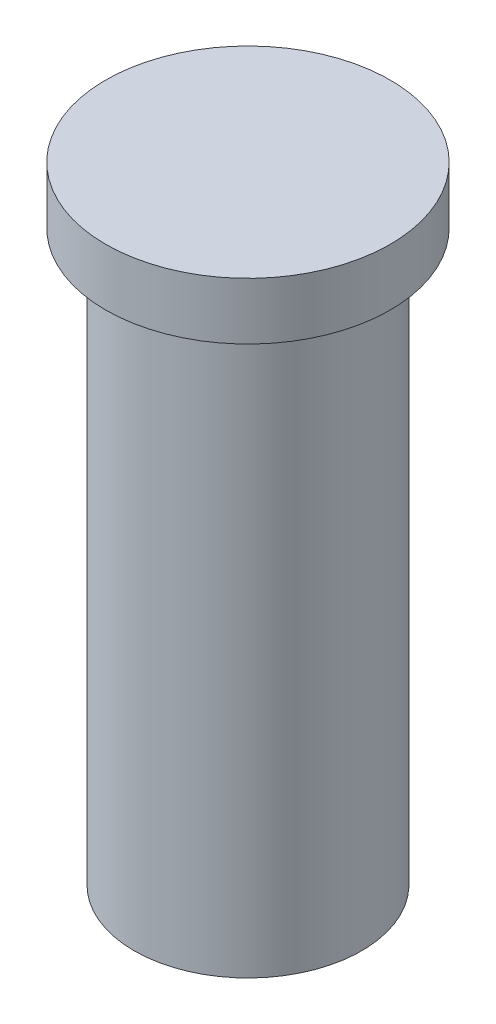
ISO-10303-21;
HEADER;
FILE_DESCRIPTION(('STEP AP214'),'2;1');
FILE_NAME('part.step','',(''),(''),'','','');
FILE_SCHEMA(('AUTOMOTIVE_DESIGN { 1 0 10303 214 1 1 1 1 }'));
ENDSEC;
DATA;
#1=APPLICATION_CONTEXT('core data for automotive mechanical design processes');
#2=APPLICATION_PROTOCOL_DEFINITION('international standard','automotive_design',2000,#1);
#3=PRODUCT_CONTEXT('',#1,'mechanical');
#4=PRODUCT('Part','Part','',(#3));
#5=PRODUCT_RELATED_PRODUCT_CATEGORY('part','',(#4));
#6=PRODUCT_DEFINITION_FORMATION('','',#4);
#7=PRODUCT_DEFINITION_CONTEXT('part definition',#1,'design');
#8=PRODUCT_DEFINITION('design','',#6,#7);
#9=PRODUCT_DEFINITION_SHAPE('','',#8);
#10=(LENGTH_UNIT() NAMED_UNIT(*) SI_UNIT(.MILLI.,.METRE.));
#11=(NAMED_UNIT(*) PLANE_ANGLE_UNIT() SI_UNIT($,.RADIAN.));
#12=(NAMED_UNIT(*) SI_UNIT($,.STERADIAN.) SOLID_ANGLE_UNIT());
#13=UNCERTAINTY_MEASURE_WITH_UNIT(LENGTH_MEASURE(1.E-05),#10,'distance_accuracy_value','');
#14=(GEOMETRIC_REPRESENTATION_CONTEXT(3) GLOBAL_UNCERTAINTY_ASSIGNED_CONTEXT((#13)) GLOBAL_UNIT_ASSIGNED_CONTEXT((#10,
#11,#12)) REPRESENTATION_CONTEXT('',''));
#15=CARTESIAN_POINT('',(0.,0.,0.));
#16=DIRECTION('',(0.,0.,1.));
#17=DIRECTION('',(1.,0.,0.));
#18=AXIS2_PLACEMENT_3D('',#15,#16,#17);
#19=CARTESIAN_POINT('',(0.,5.,0.));
#20=DIRECTION('',(0.,-1.,0.));
#21=DIRECTION('',(0.,0.,-1.));
#22=AXIS2_PLACEMENT_3D('',#19,#20,#21);
#23=CYLINDRICAL_SURFACE('',#22,12.5);
#24=CARTESIAN_POINT('',(0.,5.,0.));
#25=DIRECTION('',(0.,1.,0.));
#26=DIRECTION('',(0.,0.,1.));
#27=AXIS2_PLACEMENT_3D('',#24,#25,#26);
#28=CIRCLE('',#27,12.5);
#29=CARTESIAN_POINT('',(0.,5.,12.5));
#30=VERTEX_POINT('',#29);
#31=EDGE_CURVE('E42',#30,#30,#28,.T.);
#32=ORIENTED_EDGE('',*,*,#31,.F.);
#33=EDGE_LOOP('',(#32));
#34=FACE_BOUND('',#33,.T.);
#35=CARTESIAN_POINT('',(0.,0.,0.));
#36=DIRECTION('',(0.,1.,0.));
#37=DIRECTION('',(0.,0.,1.));
#38=AXIS2_PLACEMENT_3D('',#35,#36,#37);
#39=CIRCLE('',#38,12.5);
#40=CARTESIAN_POINT('',(0.,0.,12.5));
#41=VERTEX_POINT('',#40);
#42=EDGE_CURVE('E38',#41,#41,#39,.T.);
#43=ORIENTED_EDGE('',*,*,#42,.T.);
#44=EDGE_LOOP('',(#43));
#45=FACE_BOUND('',#44,.T.);
#46=ADVANCED_FACE('F35',(#34,#45),#23,.T.);
#47=CARTESIAN_POINT('',(0.,5.,0.));
#48=DIRECTION('',(0.,1.,0.));
#49=DIRECTION('',(0.,0.,1.));
#50=AXIS2_PLACEMENT_3D('',#47,#48,#49);
#51=PLANE('',#50);
#52=ORIENTED_EDGE('',*,*,#31,.T.);
#53=EDGE_LOOP('',(#52));
#54=FACE_BOUND('',#53,.T.);
#55=ADVANCED_FACE('F79',(#54),#51,.T.);
#56=CARTESIAN_POINT('',(0.,0.,0.));
#57=DIRECTION('',(0.,1.,0.));
#58=DIRECTION('',(0.,0.,1.));
#59=AXIS2_PLACEMENT_3D('',#56,#57,#58);
#60=PLANE('',#59);
#61=CARTESIAN_POINT('',(0.,0.,0.));
#62=DIRECTION('',(0.,-1.,0.));
#63=DIRECTION('',(0.,0.,-1.));
#64=AXIS2_PLACEMENT_3D('',#61,#62,#63);
#65=CIRCLE('',#64,10.);
#66=CARTESIAN_POINT('',(0.,0.,-10.));
#67=VERTEX_POINT('',#66);
#68=EDGE_CURVE('E10',#67,#67,#65,.T.);
#69=ORIENTED_EDGE('',*,*,#68,.F.);
#70=EDGE_LOOP('',(#69));
#71=FACE_BOUND('',#70,.T.);
#72=ORIENTED_EDGE('',*,*,#42,.F.);
#73=EDGE_LOOP('',(#72));
#74=FACE_BOUND('',#73,.T.);
#75=ADVANCED_FACE('F74',(#71,#74),#60,.F.);
#76=CARTESIAN_POINT('',(0.,-50.,0.));
#77=DIRECTION('',(0.,1.,0.));
#78=DIRECTION('',(0.,0.,1.));
#79=AXIS2_PLACEMENT_3D('',#76,#77,#78);
#80=CYLINDRICAL_SURFACE('',#79,10.);
#81=CARTESIAN_POINT('',(0.,-50.,0.));
#82=DIRECTION('',(0.,-1.,0.));
#83=DIRECTION('',(0.,0.,-1.));
#84=AXIS2_PLACEMENT_3D('',#81,#82,#83);
#85=CIRCLE('',#84,10.);
#86=CARTESIAN_POINT('',(0.,-50.,-10.));
#87=VERTEX_POINT('',#86);
#88=EDGE_CURVE('E48',#87,#87,#85,.T.);
#89=ORIENTED_EDGE('',*,*,#88,.F.);
#90=EDGE_LOOP('',(#89));
#91=FACE_BOUND('',#90,.T.);
#92=ORIENTED_EDGE('',*,*,#68,.T.);
#93=EDGE_LOOP('',(#92));
#94=FACE_BOUND('',#93,.T.);
#95=ADVANCED_FACE('F69',(#91,#94),#80,.T.);
#96=CARTESIAN_POINT('',(0.,-50.,0.));
#97=DIRECTION('',(0.,-1.,0.));
#98=DIRECTION('',(0.,0.,-1.));
#99=AXIS2_PLACEMENT_3D('',#96,#97,#98);
#100=PLANE('',#99);
#101=CARTESIAN_POINT('',(0.,-50.,0.));
#102=DIRECTION('',(0.,-1.,0.));
#103=DIRECTION('',(0.,0.,-1.));
#104=AXIS2_PLACEMENT_3D('',#101,#102,#103);
#105=CIRCLE('',#104,7.5);
#106=CARTESIAN_POINT('',(0.,-50.,-7.5));
#107=VERTEX_POINT('',#106);
#108=EDGE_CURVE('E52',#107,#107,#105,.T.);
#109=ORIENTED_EDGE('',*,*,#108,.F.);
#110=EDGE_LOOP('',(#109));
#111=FACE_BOUND('',#110,.T.);
#112=ORIENTED_EDGE('',*,*,#88,.T.);
#113=EDGE_LOOP('',(#112));
#114=FACE_BOUND('',#113,.T.);
#115=ADVANCED_FACE('F63',(#111,#114),#100,.T.);
#116=CARTESIAN_POINT('',(0.,0.,0.));
#117=DIRECTION('',(0.,-1.,0.));
#118=DIRECTION('',(0.,0.,-1.));
#119=AXIS2_PLACEMENT_3D('',#116,#117,#118);
#120=CYLINDRICAL_SURFACE('',#119,7.5);
#121=CARTESIAN_POINT('',(0.,0.,0.));
#122=DIRECTION('',(0.,-1.,0.));
#123=DIRECTION('',(0.,0.,-1.));
#124=AXIS2_PLACEMENT_3D('',#121,#122,#123);
#125=CIRCLE('',#124,7.5);
#126=CARTESIAN_POINT('',(0.,0.,-7.5));
#127=VERTEX_POINT('',#126);
#128=EDGE_CURVE('E51',#127,#127,#125,.T.);
#129=ORIENTED_EDGE('',*,*,#128,.F.);
#130=EDGE_LOOP('',(#129));
#131=FACE_BOUND('',#130,.T.);
#132=ORIENTED_EDGE('',*,*,#108,.T.);
#133=EDGE_LOOP('',(#132));
#134=FACE_BOUND('',#133,.T.);
#135=ADVANCED_FACE('F60',(#131,#134),#120,.F.);
#136=CARTESIAN_POINT('',(0.,0.,0.));
#137=DIRECTION('',(0.,-1.,0.));
#138=DIRECTION('',(0.,0.,-1.));
#139=AXIS2_PLACEMENT_3D('',#136,#137,#138);
#140=PLANE('',#139);
#141=ORIENTED_EDGE('',*,*,#128,.T.);
#142=EDGE_LOOP('',(#141));
#143=FACE_BOUND('',#142,.T.);
#144=ADVANCED_FACE('F58',(#143),#140,.T.);
#145=CLOSED_SHELL('',(#46,#55,#75,#95,#115,#135,#144));
#146=MANIFOLD_SOLID_BREP('B2',#145);
#147=ADVANCED_BREP_SHAPE_REPRESENTATION('',(#18,#146),#14);
#148=SHAPE_DEFINITION_REPRESENTATION(#9,#147);
ENDSEC;
END-ISO-10303-21;
